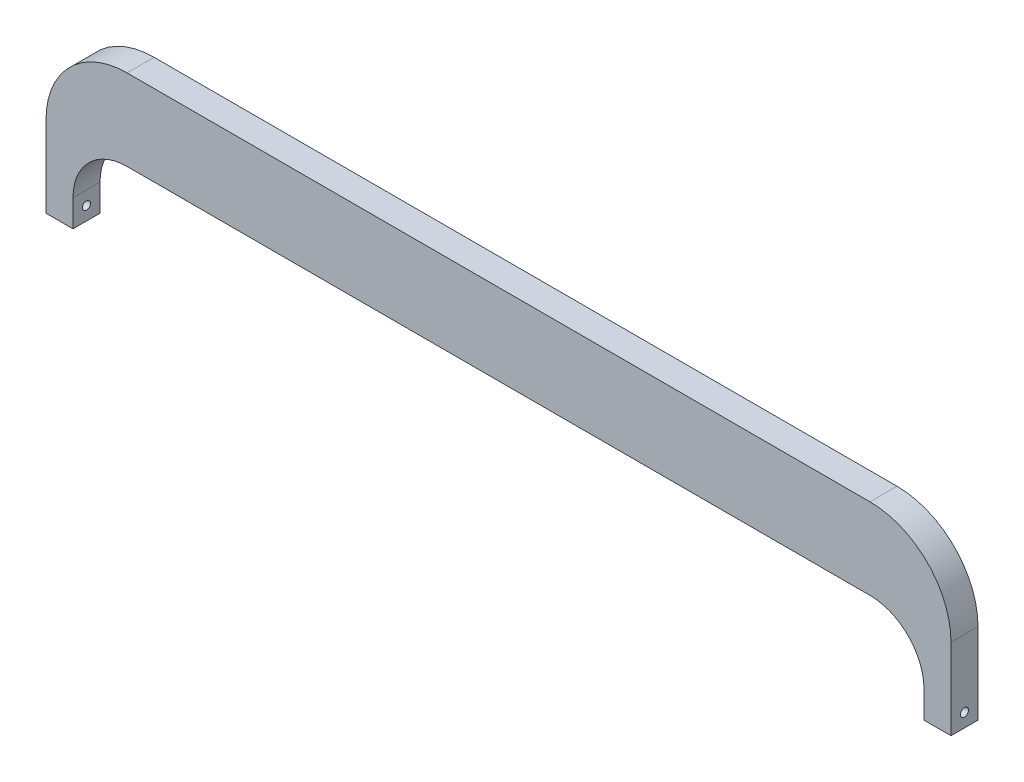
ISO-10303-21;
HEADER;
FILE_DESCRIPTION(('STEP AP214'),'2;1');
FILE_NAME('part.step','',(''),(''),'','','');
FILE_SCHEMA(('AUTOMOTIVE_DESIGN { 1 0 10303 214 1 1 1 1 }'));
ENDSEC;
DATA;
#1=APPLICATION_CONTEXT('core data for automotive mechanical design processes');
#2=APPLICATION_PROTOCOL_DEFINITION('international standard','automotive_design',2000,#1);
#3=PRODUCT_CONTEXT('',#1,'mechanical');
#4=PRODUCT('Part','Part','',(#3));
#5=PRODUCT_RELATED_PRODUCT_CATEGORY('part','',(#4));
#6=PRODUCT_DEFINITION_FORMATION('','',#4);
#7=PRODUCT_DEFINITION_CONTEXT('part definition',#1,'design');
#8=PRODUCT_DEFINITION('design','',#6,#7);
#9=PRODUCT_DEFINITION_SHAPE('','',#8);
#10=(LENGTH_UNIT() NAMED_UNIT(*) SI_UNIT(.MILLI.,.METRE.));
#11=(NAMED_UNIT(*) PLANE_ANGLE_UNIT() SI_UNIT($,.RADIAN.));
#12=(NAMED_UNIT(*) SI_UNIT($,.STERADIAN.) SOLID_ANGLE_UNIT());
#13=UNCERTAINTY_MEASURE_WITH_UNIT(LENGTH_MEASURE(1.E-05),#10,'distance_accuracy_value','');
#14=(GEOMETRIC_REPRESENTATION_CONTEXT(3) GLOBAL_UNCERTAINTY_ASSIGNED_CONTEXT((#13)) GLOBAL_UNIT_ASSIGNED_CONTEXT((#10,
#11,#12)) REPRESENTATION_CONTEXT('',''));
#15=CARTESIAN_POINT('',(0.,0.,0.));
#16=DIRECTION('',(0.,0.,1.));
#17=DIRECTION('',(1.,0.,0.));
#18=AXIS2_PLACEMENT_3D('',#15,#16,#17);
#19=CARTESIAN_POINT('',(0.,-6.,2.));
#20=DIRECTION('',(0.,1.,0.));
#21=DIRECTION('',(0.,0.,1.));
#22=AXIS2_PLACEMENT_3D('',#19,#20,#21);
#23=PLANE('',#22);
#24=DIRECTION('',(1.,0.,0.));
#25=VECTOR('',#24,1.);
#26=CARTESIAN_POINT('',(0.,-6.,0.));
#27=LINE('',#26,#25);
#28=CARTESIAN_POINT('',(-27.5,-6.,0.));
#29=VERTEX_POINT('',#28);
#30=CARTESIAN_POINT('',(27.5,-6.,0.));
#31=VERTEX_POINT('',#30);
#32=EDGE_CURVE('E156',#29,#31,#27,.T.);
#33=ORIENTED_EDGE('',*,*,#32,.T.);
#34=DIRECTION('',(0.,0.,-1.));
#35=VECTOR('',#34,1.);
#36=CARTESIAN_POINT('',(27.5,-6.,2.));
#37=LINE('',#36,#35);
#38=CARTESIAN_POINT('',(27.5,-6.,2.));
#39=VERTEX_POINT('',#38);
#40=EDGE_CURVE('E11',#39,#31,#37,.T.);
#41=ORIENTED_EDGE('',*,*,#40,.F.);
#42=DIRECTION('',(1.,0.,0.));
#43=VECTOR('',#42,1.);
#44=CARTESIAN_POINT('',(0.,-6.,2.));
#45=LINE('',#44,#43);
#46=CARTESIAN_POINT('',(-27.5,-6.,2.));
#47=VERTEX_POINT('',#46);
#48=EDGE_CURVE('E187',#47,#39,#45,.T.);
#49=ORIENTED_EDGE('',*,*,#48,.F.);
#50=DIRECTION('',(0.,0.,-1.));
#51=VECTOR('',#50,1.);
#52=CARTESIAN_POINT('',(-27.5,-6.,2.));
#53=LINE('',#52,#51);
#54=EDGE_CURVE('E51',#47,#29,#53,.T.);
#55=ORIENTED_EDGE('',*,*,#54,.T.);
#56=EDGE_LOOP('',(#33,#41,#49,#55));
#57=FACE_BOUND('',#56,.T.);
#58=ADVANCED_FACE('F35',(#57),#23,.F.);
#59=CARTESIAN_POINT('',(27.5,-10.,2.));
#60=DIRECTION('',(0.,0.,-1.));
#61=DIRECTION('',(-1.,0.,0.));
#62=AXIS2_PLACEMENT_3D('',#59,#60,#61);
#63=CYLINDRICAL_SURFACE('',#62,4.);
#64=CARTESIAN_POINT('',(27.5,-10.,0.));
#65=DIRECTION('',(0.,0.,1.));
#66=DIRECTION('',(1.,0.,0.));
#67=AXIS2_PLACEMENT_3D('',#64,#65,#66);
#68=CIRCLE('',#67,4.);
#69=CARTESIAN_POINT('',(31.5,-10.,0.));
#70=VERTEX_POINT('',#69);
#71=EDGE_CURVE('E158',#31,#70,#68,.F.);
#72=ORIENTED_EDGE('',*,*,#71,.T.);
#73=DIRECTION('',(0.,0.,-1.));
#74=VECTOR('',#73,1.);
#75=CARTESIAN_POINT('',(31.5,-10.,2.));
#76=LINE('',#75,#74);
#77=CARTESIAN_POINT('',(31.5,-10.,2.));
#78=VERTEX_POINT('',#77);
#79=EDGE_CURVE('E43',#78,#70,#76,.T.);
#80=ORIENTED_EDGE('',*,*,#79,.F.);
#81=CARTESIAN_POINT('',(27.5,-10.,2.));
#82=DIRECTION('',(0.,0.,1.));
#83=DIRECTION('',(1.,0.,0.));
#84=AXIS2_PLACEMENT_3D('',#81,#82,#83);
#85=CIRCLE('',#84,4.);
#86=EDGE_CURVE('E102',#39,#78,#85,.F.);
#87=ORIENTED_EDGE('',*,*,#86,.F.);
#88=ORIENTED_EDGE('',*,*,#40,.T.);
#89=EDGE_LOOP('',(#72,#80,#87,#88));
#90=FACE_BOUND('',#89,.T.);
#91=ADVANCED_FACE('F209',(#90),#63,.F.);
#92=CARTESIAN_POINT('',(31.5,0.,2.));
#93=DIRECTION('',(-1.,0.,0.));
#94=DIRECTION('',(0.,0.,1.));
#95=AXIS2_PLACEMENT_3D('',#92,#93,#94);
#96=PLANE('',#95);
#97=CARTESIAN_POINT('',(31.5,-11.,1.));
#98=DIRECTION('',(1.,0.,0.));
#99=DIRECTION('',(0.,0.,-1.));
#100=AXIS2_PLACEMENT_3D('',#97,#98,#99);
#101=CIRCLE('',#100,0.3);
#102=CARTESIAN_POINT('',(31.5,-11.,0.7));
#103=VERTEX_POINT('',#102);
#104=EDGE_CURVE('E159',#103,#103,#101,.T.);
#105=ORIENTED_EDGE('',*,*,#104,.T.);
#106=EDGE_LOOP('',(#105));
#107=FACE_BOUND('',#106,.T.);
#108=DIRECTION('',(0.,1.,0.));
#109=VECTOR('',#108,1.);
#110=CARTESIAN_POINT('',(31.5,0.,0.));
#111=LINE('',#110,#109);
#112=CARTESIAN_POINT('',(31.5,-12.,0.));
#113=VERTEX_POINT('',#112);
#114=EDGE_CURVE('E162',#113,#70,#111,.T.);
#115=ORIENTED_EDGE('',*,*,#114,.F.);
#116=DIRECTION('',(0.,0.,-1.));
#117=VECTOR('',#116,1.);
#118=CARTESIAN_POINT('',(31.5,-12.,2.));
#119=LINE('',#118,#117);
#120=CARTESIAN_POINT('',(31.5,-12.,2.));
#121=VERTEX_POINT('',#120);
#122=EDGE_CURVE('E202',#121,#113,#119,.T.);
#123=ORIENTED_EDGE('',*,*,#122,.F.);
#124=DIRECTION('',(0.,1.,0.));
#125=VECTOR('',#124,1.);
#126=CARTESIAN_POINT('',(31.5,0.,2.));
#127=LINE('',#126,#125);
#128=EDGE_CURVE('E208',#121,#78,#127,.T.);
#129=ORIENTED_EDGE('',*,*,#128,.T.);
#130=ORIENTED_EDGE('',*,*,#79,.T.);
#131=EDGE_LOOP('',(#115,#123,#129,#130));
#132=FACE_BOUND('',#131,.T.);
#133=ADVANCED_FACE('F206',(#107,#132),#96,.T.);
#134=CARTESIAN_POINT('',(0.,-12.,2.));
#135=DIRECTION('',(0.,-1.,0.));
#136=DIRECTION('',(0.,0.,-1.));
#137=AXIS2_PLACEMENT_3D('',#134,#135,#136);
#138=PLANE('',#137);
#139=DIRECTION('',(-1.,0.,0.));
#140=VECTOR('',#139,1.);
#141=CARTESIAN_POINT('',(0.,-12.,0.));
#142=LINE('',#141,#140);
#143=CARTESIAN_POINT('',(33.5,-12.,0.));
#144=VERTEX_POINT('',#143);
#145=EDGE_CURVE('E165',#144,#113,#142,.T.);
#146=ORIENTED_EDGE('',*,*,#145,.F.);
#147=DIRECTION('',(0.,0.,-1.));
#148=VECTOR('',#147,1.);
#149=CARTESIAN_POINT('',(33.5,-12.,2.));
#150=LINE('',#149,#148);
#151=CARTESIAN_POINT('',(33.5,-12.,2.));
#152=VERTEX_POINT('',#151);
#153=EDGE_CURVE('E200',#152,#144,#150,.T.);
#154=ORIENTED_EDGE('',*,*,#153,.F.);
#155=DIRECTION('',(-1.,0.,0.));
#156=VECTOR('',#155,1.);
#157=CARTESIAN_POINT('',(0.,-12.,2.));
#158=LINE('',#157,#156);
#159=EDGE_CURVE('E219',#152,#121,#158,.T.);
#160=ORIENTED_EDGE('',*,*,#159,.T.);
#161=ORIENTED_EDGE('',*,*,#122,.T.);
#162=EDGE_LOOP('',(#146,#154,#160,#161));
#163=FACE_BOUND('',#162,.T.);
#164=ADVANCED_FACE('F216',(#163),#138,.T.);
#165=CARTESIAN_POINT('',(33.5,0.,2.));
#166=DIRECTION('',(1.,0.,0.));
#167=DIRECTION('',(0.,0.,-1.));
#168=AXIS2_PLACEMENT_3D('',#165,#166,#167);
#169=PLANE('',#168);
#170=CARTESIAN_POINT('',(33.5,-11.,1.));
#171=DIRECTION('',(1.,0.,0.));
#172=DIRECTION('',(0.,0.,-1.));
#173=AXIS2_PLACEMENT_3D('',#170,#171,#172);
#174=CIRCLE('',#173,0.3);
#175=CARTESIAN_POINT('',(33.5,-11.,0.7));
#176=VERTEX_POINT('',#175);
#177=EDGE_CURVE('E262',#176,#176,#174,.T.);
#178=ORIENTED_EDGE('',*,*,#177,.F.);
#179=EDGE_LOOP('',(#178));
#180=FACE_BOUND('',#179,.T.);
#181=DIRECTION('',(0.,-1.,0.));
#182=VECTOR('',#181,1.);
#183=CARTESIAN_POINT('',(33.5,0.,0.));
#184=LINE('',#183,#182);
#185=CARTESIAN_POINT('',(33.5,-6.,0.));
#186=VERTEX_POINT('',#185);
#187=EDGE_CURVE('E168',#186,#144,#184,.T.);
#188=ORIENTED_EDGE('',*,*,#187,.F.);
#189=DIRECTION('',(0.,0.,-1.));
#190=VECTOR('',#189,1.);
#191=CARTESIAN_POINT('',(33.5,-6.,2.));
#192=LINE('',#191,#190);
#193=CARTESIAN_POINT('',(33.5,-6.,2.));
#194=VERTEX_POINT('',#193);
#195=EDGE_CURVE('E198',#194,#186,#192,.T.);
#196=ORIENTED_EDGE('',*,*,#195,.F.);
#197=DIRECTION('',(0.,-1.,0.));
#198=VECTOR('',#197,1.);
#199=CARTESIAN_POINT('',(33.5,0.,2.));
#200=LINE('',#199,#198);
#201=EDGE_CURVE('E223',#194,#152,#200,.T.);
#202=ORIENTED_EDGE('',*,*,#201,.T.);
#203=ORIENTED_EDGE('',*,*,#153,.T.);
#204=EDGE_LOOP('',(#188,#196,#202,#203));
#205=FACE_BOUND('',#204,.T.);
#206=ADVANCED_FACE('F297',(#180,#205),#169,.T.);
#207=CARTESIAN_POINT('',(27.5,-6.,2.));
#208=DIRECTION('',(0.,0.,-1.));
#209=DIRECTION('',(-1.,0.,0.));
#210=AXIS2_PLACEMENT_3D('',#207,#208,#209);
#211=CYLINDRICAL_SURFACE('',#210,6.);
#212=CARTESIAN_POINT('',(27.5,-6.,0.));
#213=DIRECTION('',(0.,0.,1.));
#214=DIRECTION('',(1.,0.,0.));
#215=AXIS2_PLACEMENT_3D('',#212,#213,#214);
#216=CIRCLE('',#215,6.);
#217=CARTESIAN_POINT('',(27.5,0.,0.));
#218=VERTEX_POINT('',#217);
#219=EDGE_CURVE('E171',#218,#186,#216,.F.);
#220=ORIENTED_EDGE('',*,*,#219,.F.);
#221=DIRECTION('',(0.,0.,-1.));
#222=VECTOR('',#221,1.);
#223=CARTESIAN_POINT('',(27.5,0.,2.));
#224=LINE('',#223,#222);
#225=CARTESIAN_POINT('',(27.5,0.,2.));
#226=VERTEX_POINT('',#225);
#227=EDGE_CURVE('E196',#226,#218,#224,.T.);
#228=ORIENTED_EDGE('',*,*,#227,.F.);
#229=CARTESIAN_POINT('',(27.5,-6.,2.));
#230=DIRECTION('',(0.,0.,1.));
#231=DIRECTION('',(1.,0.,0.));
#232=AXIS2_PLACEMENT_3D('',#229,#230,#231);
#233=CIRCLE('',#232,6.);
#234=EDGE_CURVE('E229',#226,#194,#233,.F.);
#235=ORIENTED_EDGE('',*,*,#234,.T.);
#236=ORIENTED_EDGE('',*,*,#195,.T.);
#237=EDGE_LOOP('',(#220,#228,#235,#236));
#238=FACE_BOUND('',#237,.T.);
#239=ADVANCED_FACE('F293',(#238),#211,.T.);
#240=CARTESIAN_POINT('',(0.,0.,2.));
#241=DIRECTION('',(0.,1.,0.));
#242=DIRECTION('',(0.,0.,1.));
#243=AXIS2_PLACEMENT_3D('',#240,#241,#242);
#244=PLANE('',#243);
#245=DIRECTION('',(1.,0.,0.));
#246=VECTOR('',#245,1.);
#247=CARTESIAN_POINT('',(0.,0.,0.));
#248=LINE('',#247,#246);
#249=CARTESIAN_POINT('',(-27.5,0.,0.));
#250=VERTEX_POINT('',#249);
#251=EDGE_CURVE('E174',#250,#218,#248,.T.);
#252=ORIENTED_EDGE('',*,*,#251,.F.);
#253=DIRECTION('',(0.,0.,-1.));
#254=VECTOR('',#253,1.);
#255=CARTESIAN_POINT('',(-27.5,0.,2.));
#256=LINE('',#255,#254);
#257=CARTESIAN_POINT('',(-27.5,0.,2.));
#258=VERTEX_POINT('',#257);
#259=EDGE_CURVE('E194',#258,#250,#256,.T.);
#260=ORIENTED_EDGE('',*,*,#259,.F.);
#261=DIRECTION('',(1.,0.,0.));
#262=VECTOR('',#261,1.);
#263=CARTESIAN_POINT('',(0.,0.,2.));
#264=LINE('',#263,#262);
#265=EDGE_CURVE('E232',#258,#226,#264,.T.);
#266=ORIENTED_EDGE('',*,*,#265,.T.);
#267=ORIENTED_EDGE('',*,*,#227,.T.);
#268=EDGE_LOOP('',(#252,#260,#266,#267));
#269=FACE_BOUND('',#268,.T.);
#270=ADVANCED_FACE('F288',(#269),#244,.T.);
#271=CARTESIAN_POINT('',(-27.5,-6.,2.));
#272=DIRECTION('',(0.,0.,-1.));
#273=DIRECTION('',(-1.,0.,0.));
#274=AXIS2_PLACEMENT_3D('',#271,#272,#273);
#275=CYLINDRICAL_SURFACE('',#274,6.);
#276=CARTESIAN_POINT('',(-27.5,-6.,0.));
#277=DIRECTION('',(0.,0.,1.));
#278=DIRECTION('',(1.,0.,0.));
#279=AXIS2_PLACEMENT_3D('',#276,#277,#278);
#280=CIRCLE('',#279,6.);
#281=CARTESIAN_POINT('',(-33.5,-6.,0.));
#282=VERTEX_POINT('',#281);
#283=EDGE_CURVE('E177',#250,#282,#280,.T.);
#284=ORIENTED_EDGE('',*,*,#283,.T.);
#285=DIRECTION('',(0.,0.,-1.));
#286=VECTOR('',#285,1.);
#287=CARTESIAN_POINT('',(-33.5,-6.,2.));
#288=LINE('',#287,#286);
#289=CARTESIAN_POINT('',(-33.5,-6.,2.));
#290=VERTEX_POINT('',#289);
#291=EDGE_CURVE('E191',#290,#282,#288,.T.);
#292=ORIENTED_EDGE('',*,*,#291,.F.);
#293=CARTESIAN_POINT('',(-27.5,-6.,2.));
#294=DIRECTION('',(0.,0.,1.));
#295=DIRECTION('',(1.,0.,0.));
#296=AXIS2_PLACEMENT_3D('',#293,#294,#295);
#297=CIRCLE('',#296,6.);
#298=EDGE_CURVE('E235',#258,#290,#297,.T.);
#299=ORIENTED_EDGE('',*,*,#298,.F.);
#300=ORIENTED_EDGE('',*,*,#259,.T.);
#301=EDGE_LOOP('',(#284,#292,#299,#300));
#302=FACE_BOUND('',#301,.T.);
#303=ADVANCED_FACE('F241',(#302),#275,.T.);
#304=CARTESIAN_POINT('',(-33.5,0.,2.));
#305=DIRECTION('',(1.,0.,0.));
#306=DIRECTION('',(0.,0.,-1.));
#307=AXIS2_PLACEMENT_3D('',#304,#305,#306);
#308=PLANE('',#307);
#309=CARTESIAN_POINT('',(-33.5,-11.,1.));
#310=DIRECTION('',(-1.,0.,0.));
#311=DIRECTION('',(0.,0.,1.));
#312=AXIS2_PLACEMENT_3D('',#309,#310,#311);
#313=CIRCLE('',#312,0.3);
#314=CARTESIAN_POINT('',(-33.5,-11.,1.3));
#315=VERTEX_POINT('',#314);
#316=EDGE_CURVE('E268',#315,#315,#313,.T.);
#317=ORIENTED_EDGE('',*,*,#316,.F.);
#318=EDGE_LOOP('',(#317));
#319=FACE_BOUND('',#318,.T.);
#320=DIRECTION('',(0.,-1.,0.));
#321=VECTOR('',#320,1.);
#322=CARTESIAN_POINT('',(-33.5,0.,0.));
#323=LINE('',#322,#321);
#324=CARTESIAN_POINT('',(-33.5,-12.,0.));
#325=VERTEX_POINT('',#324);
#326=EDGE_CURVE('E179',#282,#325,#323,.T.);
#327=ORIENTED_EDGE('',*,*,#326,.T.);
#328=DIRECTION('',(0.,0.,-1.));
#329=VECTOR('',#328,1.);
#330=CARTESIAN_POINT('',(-33.5,-12.,2.));
#331=LINE('',#330,#329);
#332=CARTESIAN_POINT('',(-33.5,-12.,2.));
#333=VERTEX_POINT('',#332);
#334=EDGE_CURVE('E148',#333,#325,#331,.T.);
#335=ORIENTED_EDGE('',*,*,#334,.F.);
#336=DIRECTION('',(0.,-1.,0.));
#337=VECTOR('',#336,1.);
#338=CARTESIAN_POINT('',(-33.5,0.,2.));
#339=LINE('',#338,#337);
#340=EDGE_CURVE('E136',#290,#333,#339,.T.);
#341=ORIENTED_EDGE('',*,*,#340,.F.);
#342=ORIENTED_EDGE('',*,*,#291,.T.);
#343=EDGE_LOOP('',(#327,#335,#341,#342));
#344=FACE_BOUND('',#343,.T.);
#345=ADVANCED_FACE('F245',(#319,#344),#308,.F.);
#346=CARTESIAN_POINT('',(0.,-12.,2.));
#347=DIRECTION('',(0.,1.,0.));
#348=DIRECTION('',(0.,0.,1.));
#349=AXIS2_PLACEMENT_3D('',#346,#347,#348);
#350=PLANE('',#349);
#351=DIRECTION('',(1.,0.,0.));
#352=VECTOR('',#351,1.);
#353=CARTESIAN_POINT('',(0.,-12.,0.));
#354=LINE('',#353,#352);
#355=CARTESIAN_POINT('',(-31.5,-12.,0.));
#356=VERTEX_POINT('',#355);
#357=EDGE_CURVE('E145',#325,#356,#354,.T.);
#358=ORIENTED_EDGE('',*,*,#357,.T.);
#359=DIRECTION('',(0.,0.,-1.));
#360=VECTOR('',#359,1.);
#361=CARTESIAN_POINT('',(-31.5,-12.,2.));
#362=LINE('',#361,#360);
#363=CARTESIAN_POINT('',(-31.5,-12.,2.));
#364=VERTEX_POINT('',#363);
#365=EDGE_CURVE('E142',#364,#356,#362,.T.);
#366=ORIENTED_EDGE('',*,*,#365,.F.);
#367=DIRECTION('',(1.,0.,0.));
#368=VECTOR('',#367,1.);
#369=CARTESIAN_POINT('',(0.,-12.,2.));
#370=LINE('',#369,#368);
#371=EDGE_CURVE('E129',#333,#364,#370,.T.);
#372=ORIENTED_EDGE('',*,*,#371,.F.);
#373=ORIENTED_EDGE('',*,*,#334,.T.);
#374=EDGE_LOOP('',(#358,#366,#372,#373));
#375=FACE_BOUND('',#374,.T.);
#376=ADVANCED_FACE('F143',(#375),#350,.F.);
#377=CARTESIAN_POINT('',(-31.5,0.,2.));
#378=DIRECTION('',(-1.,0.,0.));
#379=DIRECTION('',(0.,0.,1.));
#380=AXIS2_PLACEMENT_3D('',#377,#378,#379);
#381=PLANE('',#380);
#382=CARTESIAN_POINT('',(-31.5,-11.,1.));
#383=DIRECTION('',(-1.,0.,0.));
#384=DIRECTION('',(0.,0.,1.));
#385=AXIS2_PLACEMENT_3D('',#382,#383,#384);
#386=CIRCLE('',#385,0.3);
#387=CARTESIAN_POINT('',(-31.5,-11.,1.3));
#388=VERTEX_POINT('',#387);
#389=EDGE_CURVE('E265',#388,#388,#386,.T.);
#390=ORIENTED_EDGE('',*,*,#389,.T.);
#391=EDGE_LOOP('',(#390));
#392=FACE_BOUND('',#391,.T.);
#393=DIRECTION('',(0.,1.,0.));
#394=VECTOR('',#393,1.);
#395=CARTESIAN_POINT('',(-31.5,0.,0.));
#396=LINE('',#395,#394);
#397=CARTESIAN_POINT('',(-31.5,-10.,0.));
#398=VERTEX_POINT('',#397);
#399=EDGE_CURVE('E182',#356,#398,#396,.T.);
#400=ORIENTED_EDGE('',*,*,#399,.T.);
#401=DIRECTION('',(0.,0.,-1.));
#402=VECTOR('',#401,1.);
#403=CARTESIAN_POINT('',(-31.5,-10.,2.));
#404=LINE('',#403,#402);
#405=CARTESIAN_POINT('',(-31.5,-10.,2.));
#406=VERTEX_POINT('',#405);
#407=EDGE_CURVE('E90',#406,#398,#404,.T.);
#408=ORIENTED_EDGE('',*,*,#407,.F.);
#409=DIRECTION('',(0.,1.,0.));
#410=VECTOR('',#409,1.);
#411=CARTESIAN_POINT('',(-31.5,0.,2.));
#412=LINE('',#411,#410);
#413=EDGE_CURVE('E134',#364,#406,#412,.T.);
#414=ORIENTED_EDGE('',*,*,#413,.F.);
#415=ORIENTED_EDGE('',*,*,#365,.T.);
#416=EDGE_LOOP('',(#400,#408,#414,#415));
#417=FACE_BOUND('',#416,.T.);
#418=ADVANCED_FACE('F150',(#392,#417),#381,.F.);
#419=CARTESIAN_POINT('',(-27.5,-10.,2.));
#420=DIRECTION('',(0.,0.,-1.));
#421=DIRECTION('',(-1.,0.,0.));
#422=AXIS2_PLACEMENT_3D('',#419,#420,#421);
#423=CYLINDRICAL_SURFACE('',#422,4.);
#424=CARTESIAN_POINT('',(-27.5,-10.,0.));
#425=DIRECTION('',(0.,0.,1.));
#426=DIRECTION('',(1.,0.,0.));
#427=AXIS2_PLACEMENT_3D('',#424,#425,#426);
#428=CIRCLE('',#427,4.);
#429=EDGE_CURVE('E184',#29,#398,#428,.T.);
#430=ORIENTED_EDGE('',*,*,#429,.F.);
#431=ORIENTED_EDGE('',*,*,#54,.F.);
#432=CARTESIAN_POINT('',(-27.5,-10.,2.));
#433=DIRECTION('',(0.,0.,1.));
#434=DIRECTION('',(1.,0.,0.));
#435=AXIS2_PLACEMENT_3D('',#432,#433,#434);
#436=CIRCLE('',#435,4.);
#437=EDGE_CURVE('E151',#47,#406,#436,.T.);
#438=ORIENTED_EDGE('',*,*,#437,.T.);
#439=ORIENTED_EDGE('',*,*,#407,.T.);
#440=EDGE_LOOP('',(#430,#431,#438,#439));
#441=FACE_BOUND('',#440,.T.);
#442=ADVANCED_FACE('F246',(#441),#423,.F.);
#443=CARTESIAN_POINT('',(0.,0.,2.));
#444=DIRECTION('',(0.,0.,1.));
#445=DIRECTION('',(1.,0.,0.));
#446=AXIS2_PLACEMENT_3D('',#443,#444,#445);
#447=PLANE('',#446);
#448=ORIENTED_EDGE('',*,*,#48,.T.);
#449=ORIENTED_EDGE('',*,*,#86,.T.);
#450=ORIENTED_EDGE('',*,*,#128,.F.);
#451=ORIENTED_EDGE('',*,*,#159,.F.);
#452=ORIENTED_EDGE('',*,*,#201,.F.);
#453=ORIENTED_EDGE('',*,*,#234,.F.);
#454=ORIENTED_EDGE('',*,*,#265,.F.);
#455=ORIENTED_EDGE('',*,*,#298,.T.);
#456=ORIENTED_EDGE('',*,*,#340,.T.);
#457=ORIENTED_EDGE('',*,*,#371,.T.);
#458=ORIENTED_EDGE('',*,*,#413,.T.);
#459=ORIENTED_EDGE('',*,*,#437,.F.);
#460=EDGE_LOOP('',(#448,#449,#450,#451,#452,#453,#454,#455,#456,#457,#458,#459));
#461=FACE_BOUND('',#460,.T.);
#462=ADVANCED_FACE('F131',(#461),#447,.T.);
#463=CARTESIAN_POINT('',(0.,0.,0.));
#464=DIRECTION('',(0.,0.,1.));
#465=DIRECTION('',(1.,0.,0.));
#466=AXIS2_PLACEMENT_3D('',#463,#464,#465);
#467=PLANE('',#466);
#468=ORIENTED_EDGE('',*,*,#32,.F.);
#469=ORIENTED_EDGE('',*,*,#429,.T.);
#470=ORIENTED_EDGE('',*,*,#399,.F.);
#471=ORIENTED_EDGE('',*,*,#357,.F.);
#472=ORIENTED_EDGE('',*,*,#326,.F.);
#473=ORIENTED_EDGE('',*,*,#283,.F.);
#474=ORIENTED_EDGE('',*,*,#251,.T.);
#475=ORIENTED_EDGE('',*,*,#219,.T.);
#476=ORIENTED_EDGE('',*,*,#187,.T.);
#477=ORIENTED_EDGE('',*,*,#145,.T.);
#478=ORIENTED_EDGE('',*,*,#114,.T.);
#479=ORIENTED_EDGE('',*,*,#71,.F.);
#480=EDGE_LOOP('',(#468,#469,#470,#471,#472,#473,#474,#475,#476,#477,#478,#479));
#481=FACE_BOUND('',#480,.T.);
#482=ADVANCED_FACE('F212',(#481),#467,.F.);
#483=CARTESIAN_POINT('',(31.5,-11.,1.));
#484=DIRECTION('',(1.,0.,0.));
#485=DIRECTION('',(0.,0.,-1.));
#486=AXIS2_PLACEMENT_3D('',#483,#484,#485);
#487=CYLINDRICAL_SURFACE('',#486,0.3);
#488=ORIENTED_EDGE('',*,*,#104,.F.);
#489=EDGE_LOOP('',(#488));
#490=FACE_BOUND('',#489,.T.);
#491=ORIENTED_EDGE('',*,*,#177,.T.);
#492=EDGE_LOOP('',(#491));
#493=FACE_BOUND('',#492,.T.);
#494=ADVANCED_FACE('F277',(#490,#493),#487,.F.);
#495=CARTESIAN_POINT('',(-31.5,-11.,1.));
#496=DIRECTION('',(-1.,0.,0.));
#497=DIRECTION('',(0.,0.,1.));
#498=AXIS2_PLACEMENT_3D('',#495,#496,#497);
#499=CYLINDRICAL_SURFACE('',#498,0.3);
#500=ORIENTED_EDGE('',*,*,#389,.F.);
#501=EDGE_LOOP('',(#500));
#502=FACE_BOUND('',#501,.T.);
#503=ORIENTED_EDGE('',*,*,#316,.T.);
#504=EDGE_LOOP('',(#503));
#505=FACE_BOUND('',#504,.T.);
#506=ADVANCED_FACE('F274',(#502,#505),#499,.F.);
#507=CLOSED_SHELL('',(#58,#91,#133,#164,#206,#239,#270,#303,#345,#376,#418,#442,#462,#482,#494,#506));
#508=MANIFOLD_SOLID_BREP('B2',#507);
#509=ADVANCED_BREP_SHAPE_REPRESENTATION('',(#18,#508),#14);
#510=SHAPE_DEFINITION_REPRESENTATION(#9,#509);
ENDSEC;
END-ISO-10303-21;
